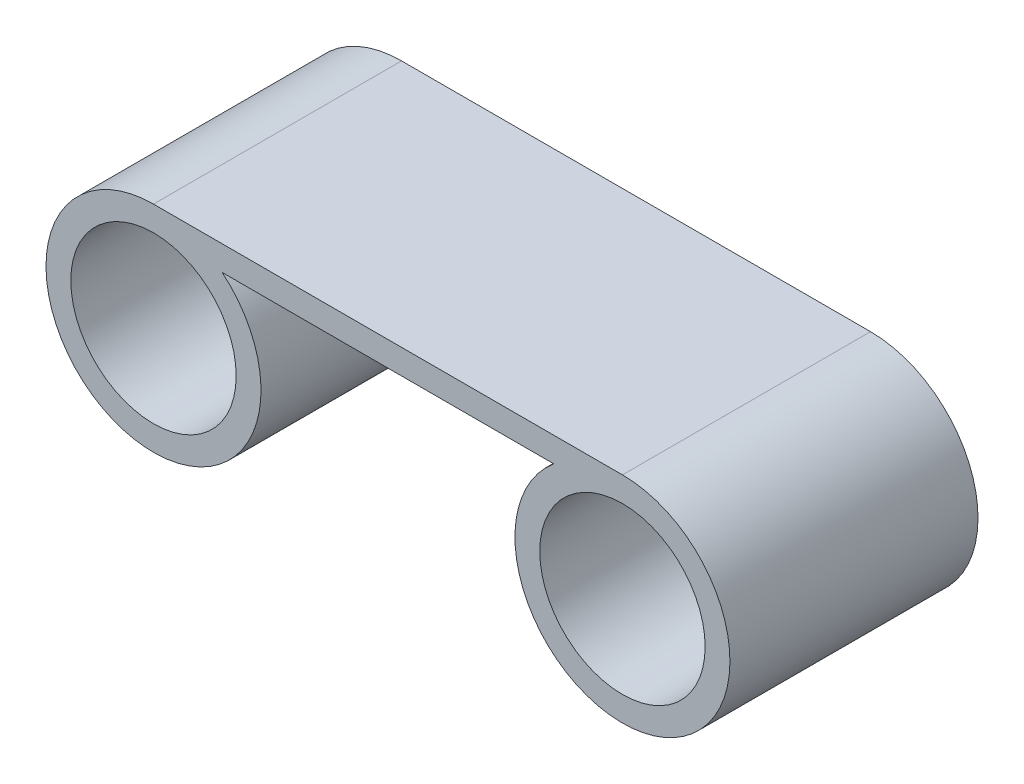
ISO-10303-21;
HEADER;
FILE_DESCRIPTION(('STEP AP214'),'2;1');
FILE_NAME('part.step','',(''),(''),'','','');
FILE_SCHEMA(('AUTOMOTIVE_DESIGN { 1 0 10303 214 1 1 1 1 }'));
ENDSEC;
DATA;
#1=APPLICATION_CONTEXT('core data for automotive mechanical design processes');
#2=APPLICATION_PROTOCOL_DEFINITION('international standard','automotive_design',2000,#1);
#3=PRODUCT_CONTEXT('',#1,'mechanical');
#4=PRODUCT('Part','Part','',(#3));
#5=PRODUCT_RELATED_PRODUCT_CATEGORY('part','',(#4));
#6=PRODUCT_DEFINITION_FORMATION('','',#4);
#7=PRODUCT_DEFINITION_CONTEXT('part definition',#1,'design');
#8=PRODUCT_DEFINITION('design','',#6,#7);
#9=PRODUCT_DEFINITION_SHAPE('','',#8);
#10=(LENGTH_UNIT() NAMED_UNIT(*) SI_UNIT(.MILLI.,.METRE.));
#11=(NAMED_UNIT(*) PLANE_ANGLE_UNIT() SI_UNIT($,.RADIAN.));
#12=(NAMED_UNIT(*) SI_UNIT($,.STERADIAN.) SOLID_ANGLE_UNIT());
#13=UNCERTAINTY_MEASURE_WITH_UNIT(LENGTH_MEASURE(1.E-05),#10,'distance_accuracy_value','');
#14=(GEOMETRIC_REPRESENTATION_CONTEXT(3) GLOBAL_UNCERTAINTY_ASSIGNED_CONTEXT((#13)) GLOBAL_UNIT_ASSIGNED_CONTEXT((#10,
#11,#12)) REPRESENTATION_CONTEXT('',''));
#15=CARTESIAN_POINT('',(0.,0.,0.));
#16=DIRECTION('',(0.,0.,1.));
#17=DIRECTION('',(1.,0.,0.));
#18=AXIS2_PLACEMENT_3D('',#15,#16,#17);
#19=CARTESIAN_POINT('',(28.3567494918519,-13.,30.));
#20=DIRECTION('',(0.,0.,1.));
#21=DIRECTION('',(1.,0.,0.));
#22=AXIS2_PLACEMENT_3D('',#19,#20,#21);
#23=PLANE('',#22);
#24=CARTESIAN_POINT('',(-28.3567494918519,-13.,30.));
#25=DIRECTION('',(0.,0.,1.));
#26=DIRECTION('',(1.,0.,0.));
#27=AXIS2_PLACEMENT_3D('',#24,#25,#26);
#28=CIRCLE('',#27,10.);
#29=CARTESIAN_POINT('',(-18.3567494918519,-13.,30.));
#30=VERTEX_POINT('',#29);
#31=EDGE_CURVE('E102',#30,#30,#28,.T.);
#32=ORIENTED_EDGE('',*,*,#31,.F.);
#33=EDGE_LOOP('',(#32));
#34=FACE_BOUND('',#33,.T.);
#35=CARTESIAN_POINT('',(28.3567494918519,-13.,30.));
#36=DIRECTION('',(0.,0.,1.));
#37=DIRECTION('',(1.,0.,0.));
#38=AXIS2_PLACEMENT_3D('',#35,#36,#37);
#39=CIRCLE('',#38,13.);
#40=CARTESIAN_POINT('',(20.0501256289338,-3.00000000000001,30.));
#41=VERTEX_POINT('',#40);
#42=CARTESIAN_POINT('',(28.3567494918519,0.,30.));
#43=VERTEX_POINT('',#42);
#44=EDGE_CURVE('E87',#41,#43,#39,.T.);
#45=ORIENTED_EDGE('',*,*,#44,.T.);
#46=DIRECTION('',(-1.,0.,0.));
#47=VECTOR('',#46,1.);
#48=CARTESIAN_POINT('',(-28.3567494918519,0.,30.));
#49=LINE('',#48,#47);
#50=CARTESIAN_POINT('',(-28.3567494918519,0.,30.));
#51=VERTEX_POINT('',#50);
#52=EDGE_CURVE('E82',#43,#51,#49,.T.);
#53=ORIENTED_EDGE('',*,*,#52,.T.);
#54=CARTESIAN_POINT('',(-28.3567494918519,-13.,30.));
#55=DIRECTION('',(0.,0.,1.));
#56=DIRECTION('',(1.,0.,0.));
#57=AXIS2_PLACEMENT_3D('',#54,#55,#56);
#58=CIRCLE('',#57,13.);
#59=CARTESIAN_POINT('',(-20.0501256289338,-3.,30.));
#60=VERTEX_POINT('',#59);
#61=EDGE_CURVE('E85',#51,#60,#58,.T.);
#62=ORIENTED_EDGE('',*,*,#61,.T.);
#63=DIRECTION('',(1.,0.,0.));
#64=VECTOR('',#63,1.);
#65=CARTESIAN_POINT('',(-20.0501256289338,-3.,30.));
#66=LINE('',#65,#64);
#67=EDGE_CURVE('E52',#60,#41,#66,.T.);
#68=ORIENTED_EDGE('',*,*,#67,.T.);
#69=EDGE_LOOP('',(#45,#53,#62,#68));
#70=FACE_BOUND('',#69,.T.);
#71=CARTESIAN_POINT('',(28.3567494918519,-13.,30.));
#72=DIRECTION('',(0.,0.,1.));
#73=DIRECTION('',(1.,0.,0.));
#74=AXIS2_PLACEMENT_3D('',#71,#72,#73);
#75=CIRCLE('',#74,10.);
#76=CARTESIAN_POINT('',(38.3567494918519,-13.,30.));
#77=VERTEX_POINT('',#76);
#78=EDGE_CURVE('E117',#77,#77,#75,.T.);
#79=ORIENTED_EDGE('',*,*,#78,.F.);
#80=EDGE_LOOP('',(#79));
#81=FACE_BOUND('',#80,.T.);
#82=ADVANCED_FACE('F35',(#34,#70,#81),#23,.T.);
#83=CARTESIAN_POINT('',(28.3567494918519,-13.,0.));
#84=DIRECTION('',(0.,0.,1.));
#85=DIRECTION('',(1.,0.,0.));
#86=AXIS2_PLACEMENT_3D('',#83,#84,#85);
#87=PLANE('',#86);
#88=CARTESIAN_POINT('',(28.3567494918519,-13.,0.));
#89=DIRECTION('',(0.,0.,1.));
#90=DIRECTION('',(1.,0.,0.));
#91=AXIS2_PLACEMENT_3D('',#88,#89,#90);
#92=CIRCLE('',#91,13.);
#93=CARTESIAN_POINT('',(20.0501256289338,-3.00000000000001,0.));
#94=VERTEX_POINT('',#93);
#95=CARTESIAN_POINT('',(28.3567494918519,0.,0.));
#96=VERTEX_POINT('',#95);
#97=EDGE_CURVE('E99',#94,#96,#92,.T.);
#98=ORIENTED_EDGE('',*,*,#97,.F.);
#99=DIRECTION('',(1.,0.,0.));
#100=VECTOR('',#99,1.);
#101=CARTESIAN_POINT('',(-20.0501256289338,-3.,0.));
#102=LINE('',#101,#100);
#103=CARTESIAN_POINT('',(-20.0501256289338,-3.,0.));
#104=VERTEX_POINT('',#103);
#105=EDGE_CURVE('E75',#104,#94,#102,.T.);
#106=ORIENTED_EDGE('',*,*,#105,.F.);
#107=CARTESIAN_POINT('',(-28.3567494918519,-13.,0.));
#108=DIRECTION('',(0.,0.,1.));
#109=DIRECTION('',(1.,0.,0.));
#110=AXIS2_PLACEMENT_3D('',#107,#108,#109);
#111=CIRCLE('',#110,13.);
#112=CARTESIAN_POINT('',(-28.3567494918519,0.,0.));
#113=VERTEX_POINT('',#112);
#114=EDGE_CURVE('E69',#113,#104,#111,.T.);
#115=ORIENTED_EDGE('',*,*,#114,.F.);
#116=DIRECTION('',(-1.,0.,0.));
#117=VECTOR('',#116,1.);
#118=CARTESIAN_POINT('',(-28.3567494918519,0.,0.));
#119=LINE('',#118,#117);
#120=EDGE_CURVE('E91',#96,#113,#119,.T.);
#121=ORIENTED_EDGE('',*,*,#120,.F.);
#122=EDGE_LOOP('',(#98,#106,#115,#121));
#123=FACE_BOUND('',#122,.T.);
#124=CARTESIAN_POINT('',(-28.3567494918519,-13.,0.));
#125=DIRECTION('',(0.,0.,1.));
#126=DIRECTION('',(1.,0.,0.));
#127=AXIS2_PLACEMENT_3D('',#124,#125,#126);
#128=CIRCLE('',#127,10.);
#129=CARTESIAN_POINT('',(-18.3567494918519,-13.,0.));
#130=VERTEX_POINT('',#129);
#131=EDGE_CURVE('E114',#130,#130,#128,.T.);
#132=ORIENTED_EDGE('',*,*,#131,.T.);
#133=EDGE_LOOP('',(#132));
#134=FACE_BOUND('',#133,.T.);
#135=CARTESIAN_POINT('',(28.3567494918519,-13.,0.));
#136=DIRECTION('',(0.,0.,1.));
#137=DIRECTION('',(1.,0.,0.));
#138=AXIS2_PLACEMENT_3D('',#135,#136,#137);
#139=CIRCLE('',#138,10.);
#140=CARTESIAN_POINT('',(38.3567494918519,-13.,0.));
#141=VERTEX_POINT('',#140);
#142=EDGE_CURVE('E120',#141,#141,#139,.T.);
#143=ORIENTED_EDGE('',*,*,#142,.T.);
#144=EDGE_LOOP('',(#143));
#145=FACE_BOUND('',#144,.T.);
#146=ADVANCED_FACE('F110',(#123,#134,#145),#87,.F.);
#147=CARTESIAN_POINT('',(28.3567494918519,-13.,30.));
#148=DIRECTION('',(0.,0.,-1.));
#149=DIRECTION('',(-1.,0.,0.));
#150=AXIS2_PLACEMENT_3D('',#147,#148,#149);
#151=CYLINDRICAL_SURFACE('',#150,13.);
#152=ORIENTED_EDGE('',*,*,#97,.T.);
#153=DIRECTION('',(0.,0.,-1.));
#154=VECTOR('',#153,1.);
#155=CARTESIAN_POINT('',(28.3567494918519,0.,30.));
#156=LINE('',#155,#154);
#157=EDGE_CURVE('E11',#43,#96,#156,.T.);
#158=ORIENTED_EDGE('',*,*,#157,.F.);
#159=ORIENTED_EDGE('',*,*,#44,.F.);
#160=DIRECTION('',(0.,0.,-1.));
#161=VECTOR('',#160,1.);
#162=CARTESIAN_POINT('',(20.0501256289338,-3.00000000000001,30.));
#163=LINE('',#162,#161);
#164=EDGE_CURVE('E95',#41,#94,#163,.T.);
#165=ORIENTED_EDGE('',*,*,#164,.T.);
#166=EDGE_LOOP('',(#152,#158,#159,#165));
#167=FACE_BOUND('',#166,.T.);
#168=ADVANCED_FACE('F37',(#167),#151,.T.);
#169=CARTESIAN_POINT('',(-28.3567494918519,0.,30.));
#170=DIRECTION('',(0.,-1.,0.));
#171=DIRECTION('',(1.,0.,0.));
#172=AXIS2_PLACEMENT_3D('',#169,#170,#171);
#173=PLANE('',#172);
#174=ORIENTED_EDGE('',*,*,#120,.T.);
#175=DIRECTION('',(0.,0.,-1.));
#176=VECTOR('',#175,1.);
#177=CARTESIAN_POINT('',(-28.3567494918519,0.,30.));
#178=LINE('',#177,#176);
#179=EDGE_CURVE('E44',#51,#113,#178,.T.);
#180=ORIENTED_EDGE('',*,*,#179,.F.);
#181=ORIENTED_EDGE('',*,*,#52,.F.);
#182=ORIENTED_EDGE('',*,*,#157,.T.);
#183=EDGE_LOOP('',(#174,#180,#181,#182));
#184=FACE_BOUND('',#183,.T.);
#185=ADVANCED_FACE('F90',(#184),#173,.F.);
#186=CARTESIAN_POINT('',(-28.3567494918519,-13.,30.));
#187=DIRECTION('',(0.,0.,-1.));
#188=DIRECTION('',(-1.,0.,0.));
#189=AXIS2_PLACEMENT_3D('',#186,#187,#188);
#190=CYLINDRICAL_SURFACE('',#189,13.);
#191=ORIENTED_EDGE('',*,*,#114,.T.);
#192=DIRECTION('',(0.,0.,-1.));
#193=VECTOR('',#192,1.);
#194=CARTESIAN_POINT('',(-20.0501256289338,-3.,30.));
#195=LINE('',#194,#193);
#196=EDGE_CURVE('E92',#60,#104,#195,.T.);
#197=ORIENTED_EDGE('',*,*,#196,.F.);
#198=ORIENTED_EDGE('',*,*,#61,.F.);
#199=ORIENTED_EDGE('',*,*,#179,.T.);
#200=EDGE_LOOP('',(#191,#197,#198,#199));
#201=FACE_BOUND('',#200,.T.);
#202=ADVANCED_FACE('F93',(#201),#190,.T.);
#203=CARTESIAN_POINT('',(-20.0501256289338,-3.,30.));
#204=DIRECTION('',(0.,1.,0.));
#205=DIRECTION('',(-1.,0.,0.));
#206=AXIS2_PLACEMENT_3D('',#203,#204,#205);
#207=PLANE('',#206);
#208=ORIENTED_EDGE('',*,*,#105,.T.);
#209=ORIENTED_EDGE('',*,*,#164,.F.);
#210=ORIENTED_EDGE('',*,*,#67,.F.);
#211=ORIENTED_EDGE('',*,*,#196,.T.);
#212=EDGE_LOOP('',(#208,#209,#210,#211));
#213=FACE_BOUND('',#212,.T.);
#214=ADVANCED_FACE('F107',(#213),#207,.F.);
#215=CARTESIAN_POINT('',(-28.3567494918519,-13.,30.));
#216=DIRECTION('',(0.,0.,-1.));
#217=DIRECTION('',(-1.,0.,0.));
#218=AXIS2_PLACEMENT_3D('',#215,#216,#217);
#219=CYLINDRICAL_SURFACE('',#218,10.);
#220=ORIENTED_EDGE('',*,*,#31,.T.);
#221=EDGE_LOOP('',(#220));
#222=FACE_BOUND('',#221,.T.);
#223=ORIENTED_EDGE('',*,*,#131,.F.);
#224=EDGE_LOOP('',(#223));
#225=FACE_BOUND('',#224,.T.);
#226=ADVANCED_FACE('F137',(#222,#225),#219,.F.);
#227=CARTESIAN_POINT('',(28.3567494918519,-13.,30.));
#228=DIRECTION('',(0.,0.,-1.));
#229=DIRECTION('',(-1.,0.,0.));
#230=AXIS2_PLACEMENT_3D('',#227,#228,#229);
#231=CYLINDRICAL_SURFACE('',#230,10.);
#232=ORIENTED_EDGE('',*,*,#78,.T.);
#233=EDGE_LOOP('',(#232));
#234=FACE_BOUND('',#233,.T.);
#235=ORIENTED_EDGE('',*,*,#142,.F.);
#236=EDGE_LOOP('',(#235));
#237=FACE_BOUND('',#236,.T.);
#238=ADVANCED_FACE('F126',(#234,#237),#231,.F.);
#239=CLOSED_SHELL('',(#82,#146,#168,#185,#202,#214,#226,#238));
#240=MANIFOLD_SOLID_BREP('B2',#239);
#241=ADVANCED_BREP_SHAPE_REPRESENTATION('',(#18,#240),#14);
#242=SHAPE_DEFINITION_REPRESENTATION(#9,#241);
ENDSEC;
END-ISO-10303-21;
